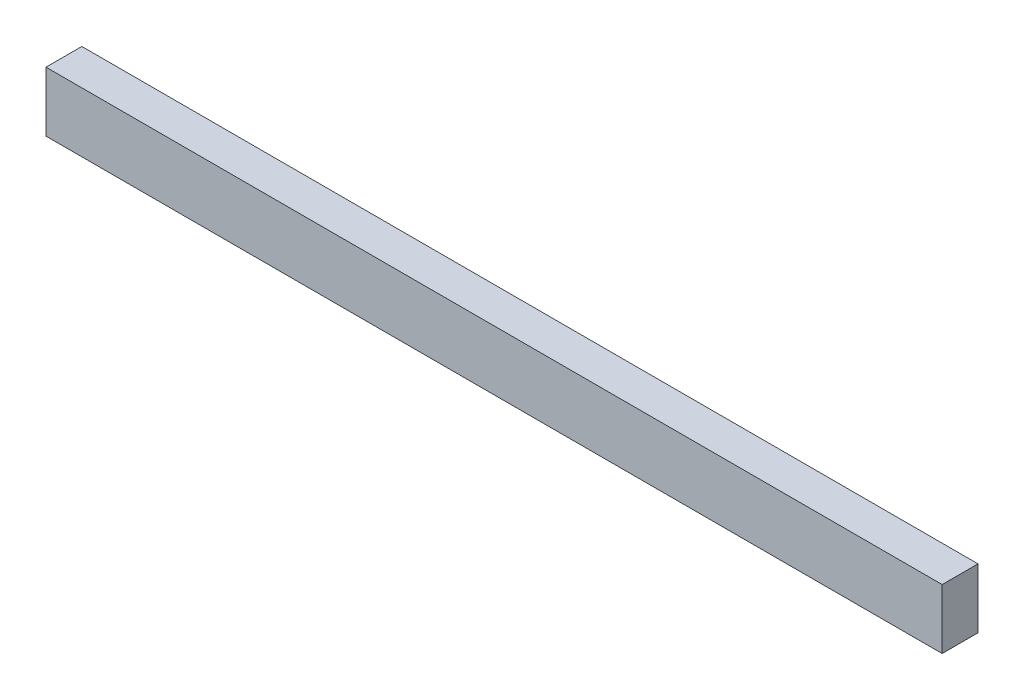
ISO-10303-21;
HEADER;
FILE_DESCRIPTION(('STEP AP214'),'2;1');
FILE_NAME('part.step','',(''),(''),'','','');
FILE_SCHEMA(('AUTOMOTIVE_DESIGN { 1 0 10303 214 1 1 1 1 }'));
ENDSEC;
DATA;
#1=APPLICATION_CONTEXT('core data for automotive mechanical design processes');
#2=APPLICATION_PROTOCOL_DEFINITION('international standard','automotive_design',2000,#1);
#3=PRODUCT_CONTEXT('',#1,'mechanical');
#4=PRODUCT('Part','Part','',(#3));
#5=PRODUCT_RELATED_PRODUCT_CATEGORY('part','',(#4));
#6=PRODUCT_DEFINITION_FORMATION('','',#4);
#7=PRODUCT_DEFINITION_CONTEXT('part definition',#1,'design');
#8=PRODUCT_DEFINITION('design','',#6,#7);
#9=PRODUCT_DEFINITION_SHAPE('','',#8);
#10=(LENGTH_UNIT() NAMED_UNIT(*) SI_UNIT(.MILLI.,.METRE.));
#11=(NAMED_UNIT(*) PLANE_ANGLE_UNIT() SI_UNIT($,.RADIAN.));
#12=(NAMED_UNIT(*) SI_UNIT($,.STERADIAN.) SOLID_ANGLE_UNIT());
#13=UNCERTAINTY_MEASURE_WITH_UNIT(LENGTH_MEASURE(1.E-05),#10,'distance_accuracy_value','');
#14=(GEOMETRIC_REPRESENTATION_CONTEXT(3) GLOBAL_UNCERTAINTY_ASSIGNED_CONTEXT((#13)) GLOBAL_UNIT_ASSIGNED_CONTEXT((#10,
#11,#12)) REPRESENTATION_CONTEXT('',''));
#15=CARTESIAN_POINT('',(0.,0.,0.));
#16=DIRECTION('',(0.,0.,1.));
#17=DIRECTION('',(1.,0.,0.));
#18=AXIS2_PLACEMENT_3D('',#15,#16,#17);
#19=CARTESIAN_POINT('',(0.,0.,6.));
#20=DIRECTION('',(1.,0.,0.));
#21=DIRECTION('',(0.,0.,-1.));
#22=AXIS2_PLACEMENT_3D('',#19,#20,#21);
#23=PLANE('',#22);
#24=DIRECTION('',(0.,-1.,0.));
#25=VECTOR('',#24,1.);
#26=CARTESIAN_POINT('',(0.,0.,0.));
#27=LINE('',#26,#25);
#28=CARTESIAN_POINT('',(0.,10.,0.));
#29=VERTEX_POINT('',#28);
#30=CARTESIAN_POINT('',(0.,0.,0.));
#31=VERTEX_POINT('',#30);
#32=EDGE_CURVE('E111',#29,#31,#27,.T.);
#33=ORIENTED_EDGE('',*,*,#32,.T.);
#34=DIRECTION('',(0.,0.,-1.));
#35=VECTOR('',#34,1.);
#36=CARTESIAN_POINT('',(0.,0.,6.));
#37=LINE('',#36,#35);
#38=CARTESIAN_POINT('',(0.,0.,6.));
#39=VERTEX_POINT('',#38);
#40=EDGE_CURVE('E11',#39,#31,#37,.T.);
#41=ORIENTED_EDGE('',*,*,#40,.F.);
#42=DIRECTION('',(0.,-1.,0.));
#43=VECTOR('',#42,1.);
#44=CARTESIAN_POINT('',(0.,0.,6.));
#45=LINE('',#44,#43);
#46=CARTESIAN_POINT('',(0.,10.,6.));
#47=VERTEX_POINT('',#46);
#48=EDGE_CURVE('E95',#47,#39,#45,.T.);
#49=ORIENTED_EDGE('',*,*,#48,.F.);
#50=DIRECTION('',(0.,0.,-1.));
#51=VECTOR('',#50,1.);
#52=CARTESIAN_POINT('',(0.,10.,6.));
#53=LINE('',#52,#51);
#54=EDGE_CURVE('E107',#47,#29,#53,.T.);
#55=ORIENTED_EDGE('',*,*,#54,.T.);
#56=EDGE_LOOP('',(#33,#41,#49,#55));
#57=FACE_BOUND('',#56,.T.);
#58=ADVANCED_FACE('F43',(#57),#23,.F.);
#59=CARTESIAN_POINT('',(0.,0.,6.));
#60=DIRECTION('',(0.,1.,0.));
#61=DIRECTION('',(0.,0.,1.));
#62=AXIS2_PLACEMENT_3D('',#59,#60,#61);
#63=PLANE('',#62);
#64=DIRECTION('',(1.,0.,0.));
#65=VECTOR('',#64,1.);
#66=CARTESIAN_POINT('',(0.,0.,0.));
#67=LINE('',#66,#65);
#68=CARTESIAN_POINT('',(150.,0.,0.));
#69=VERTEX_POINT('',#68);
#70=EDGE_CURVE('E100',#31,#69,#67,.T.);
#71=ORIENTED_EDGE('',*,*,#70,.T.);
#72=DIRECTION('',(0.,0.,-1.));
#73=VECTOR('',#72,1.);
#74=CARTESIAN_POINT('',(150.,0.,6.));
#75=LINE('',#74,#73);
#76=CARTESIAN_POINT('',(150.,0.,6.));
#77=VERTEX_POINT('',#76);
#78=EDGE_CURVE('E52',#77,#69,#75,.T.);
#79=ORIENTED_EDGE('',*,*,#78,.F.);
#80=DIRECTION('',(1.,0.,0.));
#81=VECTOR('',#80,1.);
#82=CARTESIAN_POINT('',(0.,0.,6.));
#83=LINE('',#82,#81);
#84=EDGE_CURVE('E90',#39,#77,#83,.T.);
#85=ORIENTED_EDGE('',*,*,#84,.F.);
#86=ORIENTED_EDGE('',*,*,#40,.T.);
#87=EDGE_LOOP('',(#71,#79,#85,#86));
#88=FACE_BOUND('',#87,.T.);
#89=ADVANCED_FACE('F99',(#88),#63,.F.);
#90=CARTESIAN_POINT('',(150.,0.,6.));
#91=DIRECTION('',(-1.,0.,0.));
#92=DIRECTION('',(0.,-1.,0.));
#93=AXIS2_PLACEMENT_3D('',#90,#91,#92);
#94=PLANE('',#93);
#95=DIRECTION('',(0.,1.,0.));
#96=VECTOR('',#95,1.);
#97=CARTESIAN_POINT('',(150.,0.,0.));
#98=LINE('',#97,#96);
#99=CARTESIAN_POINT('',(150.,10.,0.));
#100=VERTEX_POINT('',#99);
#101=EDGE_CURVE('E77',#69,#100,#98,.T.);
#102=ORIENTED_EDGE('',*,*,#101,.T.);
#103=DIRECTION('',(0.,0.,-1.));
#104=VECTOR('',#103,1.);
#105=CARTESIAN_POINT('',(150.,10.,6.));
#106=LINE('',#105,#104);
#107=CARTESIAN_POINT('',(150.,10.,6.));
#108=VERTEX_POINT('',#107);
#109=EDGE_CURVE('E102',#108,#100,#106,.T.);
#110=ORIENTED_EDGE('',*,*,#109,.F.);
#111=DIRECTION('',(0.,1.,0.));
#112=VECTOR('',#111,1.);
#113=CARTESIAN_POINT('',(150.,0.,6.));
#114=LINE('',#113,#112);
#115=EDGE_CURVE('E93',#77,#108,#114,.T.);
#116=ORIENTED_EDGE('',*,*,#115,.F.);
#117=ORIENTED_EDGE('',*,*,#78,.T.);
#118=EDGE_LOOP('',(#102,#110,#116,#117));
#119=FACE_BOUND('',#118,.T.);
#120=ADVANCED_FACE('F103',(#119),#94,.F.);
#121=CARTESIAN_POINT('',(0.,10.,6.));
#122=DIRECTION('',(0.,-1.,0.));
#123=DIRECTION('',(0.,0.,-1.));
#124=AXIS2_PLACEMENT_3D('',#121,#122,#123);
#125=PLANE('',#124);
#126=DIRECTION('',(-1.,0.,0.));
#127=VECTOR('',#126,1.);
#128=CARTESIAN_POINT('',(0.,10.,0.));
#129=LINE('',#128,#127);
#130=EDGE_CURVE('E83',#100,#29,#129,.T.);
#131=ORIENTED_EDGE('',*,*,#130,.T.);
#132=ORIENTED_EDGE('',*,*,#54,.F.);
#133=DIRECTION('',(-1.,0.,0.));
#134=VECTOR('',#133,1.);
#135=CARTESIAN_POINT('',(0.,10.,6.));
#136=LINE('',#135,#134);
#137=EDGE_CURVE('E60',#108,#47,#136,.T.);
#138=ORIENTED_EDGE('',*,*,#137,.F.);
#139=ORIENTED_EDGE('',*,*,#109,.T.);
#140=EDGE_LOOP('',(#131,#132,#138,#139));
#141=FACE_BOUND('',#140,.T.);
#142=ADVANCED_FACE('F124',(#141),#125,.F.);
#143=CARTESIAN_POINT('',(0.,0.,6.));
#144=DIRECTION('',(0.,0.,-1.));
#145=DIRECTION('',(-1.,0.,0.));
#146=AXIS2_PLACEMENT_3D('',#143,#144,#145);
#147=PLANE('',#146);
#148=ORIENTED_EDGE('',*,*,#48,.T.);
#149=ORIENTED_EDGE('',*,*,#84,.T.);
#150=ORIENTED_EDGE('',*,*,#115,.T.);
#151=ORIENTED_EDGE('',*,*,#137,.T.);
#152=EDGE_LOOP('',(#148,#149,#150,#151));
#153=FACE_BOUND('',#152,.T.);
#154=ADVANCED_FACE('F91',(#153),#147,.F.);
#155=CARTESIAN_POINT('',(0.,0.,0.));
#156=DIRECTION('',(0.,0.,-1.));
#157=DIRECTION('',(-1.,0.,0.));
#158=AXIS2_PLACEMENT_3D('',#155,#156,#157);
#159=PLANE('',#158);
#160=ORIENTED_EDGE('',*,*,#32,.F.);
#161=ORIENTED_EDGE('',*,*,#130,.F.);
#162=ORIENTED_EDGE('',*,*,#101,.F.);
#163=ORIENTED_EDGE('',*,*,#70,.F.);
#164=EDGE_LOOP('',(#160,#161,#162,#163));
#165=FACE_BOUND('',#164,.T.);
#166=ADVANCED_FACE('F127',(#165),#159,.T.);
#167=CLOSED_SHELL('',(#58,#89,#120,#142,#154,#166));
#168=MANIFOLD_SOLID_BREP('B2',#167);
#169=ADVANCED_BREP_SHAPE_REPRESENTATION('',(#18,#168),#14);
#170=SHAPE_DEFINITION_REPRESENTATION(#9,#169);
ENDSEC;
END-ISO-10303-21;
